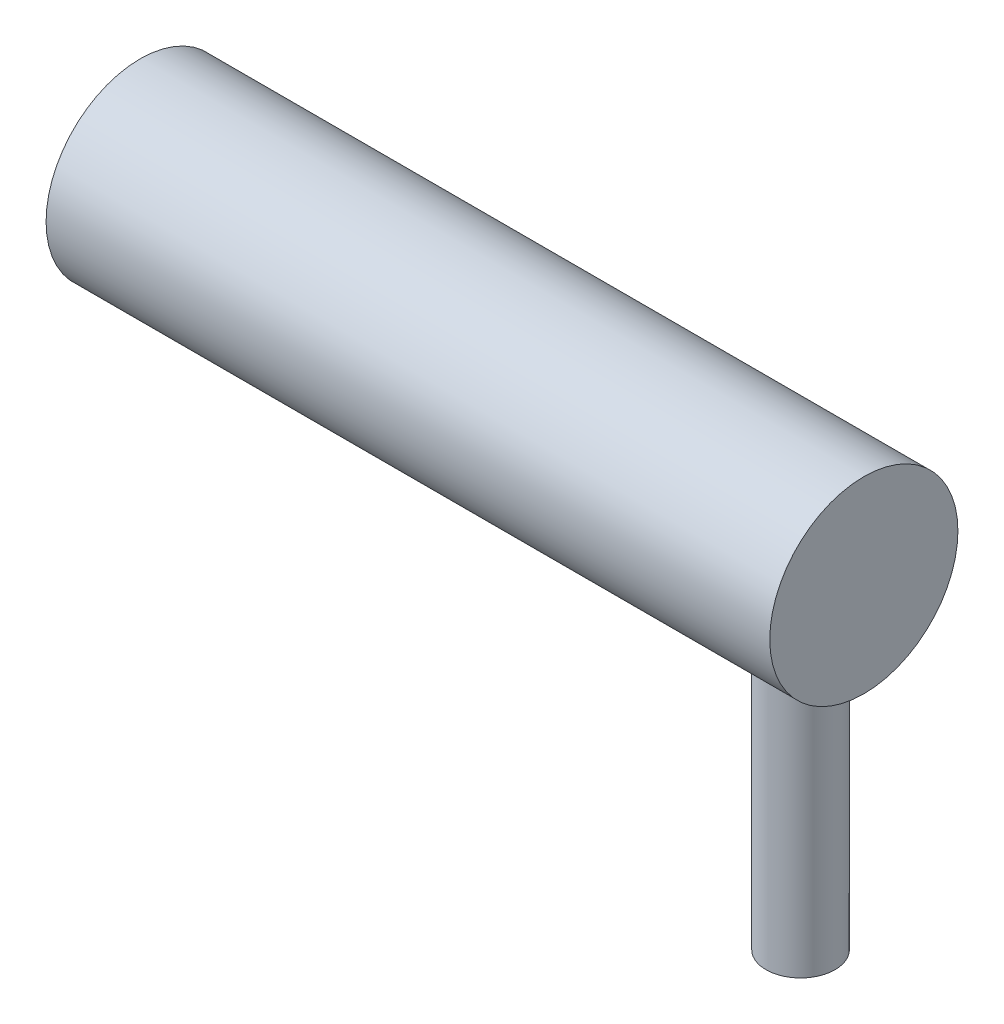
ISO-10303-21;
HEADER;
FILE_DESCRIPTION(('STEP AP214'),'2;1');
FILE_NAME('part.step','',(''),(''),'','','');
FILE_SCHEMA(('AUTOMOTIVE_DESIGN { 1 0 10303 214 1 1 1 1 }'));
ENDSEC;
DATA;
#1=APPLICATION_CONTEXT('core data for automotive mechanical design processes');
#2=APPLICATION_PROTOCOL_DEFINITION('international standard','automotive_design',2000,#1);
#3=PRODUCT_CONTEXT('',#1,'mechanical');
#4=PRODUCT('Part','Part','',(#3));
#5=PRODUCT_RELATED_PRODUCT_CATEGORY('part','',(#4));
#6=PRODUCT_DEFINITION_FORMATION('','',#4);
#7=PRODUCT_DEFINITION_CONTEXT('part definition',#1,'design');
#8=PRODUCT_DEFINITION('design','',#6,#7);
#9=PRODUCT_DEFINITION_SHAPE('','',#8);
#10=(LENGTH_UNIT() NAMED_UNIT(*) SI_UNIT(.MILLI.,.METRE.));
#11=(NAMED_UNIT(*) PLANE_ANGLE_UNIT() SI_UNIT($,.RADIAN.));
#12=(NAMED_UNIT(*) SI_UNIT($,.STERADIAN.) SOLID_ANGLE_UNIT());
#13=UNCERTAINTY_MEASURE_WITH_UNIT(LENGTH_MEASURE(1.E-05),#10,'distance_accuracy_value','');
#14=(GEOMETRIC_REPRESENTATION_CONTEXT(3) GLOBAL_UNCERTAINTY_ASSIGNED_CONTEXT((#13)) GLOBAL_UNIT_ASSIGNED_CONTEXT((#10,
#11,#12)) REPRESENTATION_CONTEXT('',''));
#15=CARTESIAN_POINT('',(0.,0.,0.));
#16=DIRECTION('',(0.,0.,1.));
#17=DIRECTION('',(1.,0.,0.));
#18=AXIS2_PLACEMENT_3D('',#15,#16,#17);
#19=CARTESIAN_POINT('',(82.502639328777,-96.,0.));
#20=DIRECTION('',(0.,1.,0.));
#21=DIRECTION('',(0.,0.,1.));
#22=AXIS2_PLACEMENT_3D('',#19,#20,#21);
#23=CYLINDRICAL_SURFACE('',#22,9.54582773587057);
#24=CARTESIAN_POINT('',(82.502639328777,-96.,0.));
#25=DIRECTION('',(0.,-1.,0.));
#26=DIRECTION('',(0.,0.,-1.));
#27=AXIS2_PLACEMENT_3D('',#24,#25,#26);
#28=CIRCLE('',#27,9.54582773587057);
#29=CARTESIAN_POINT('',(82.502639328777,-96.,-9.54582773587057));
#30=VERTEX_POINT('',#29);
#31=EDGE_CURVE('E11',#30,#30,#28,.T.);
#32=ORIENTED_EDGE('',*,*,#31,.F.);
#33=EDGE_LOOP('',(#32));
#34=FACE_BOUND('',#33,.T.);
#35=CARTESIAN_POINT('',(82.502639328777,-26.,0.));
#36=DIRECTION('',(0.,-1.,0.));
#37=DIRECTION('',(0.,0.,-1.));
#38=AXIS2_PLACEMENT_3D('',#35,#36,#37);
#39=CIRCLE('',#38,9.54582773587057);
#40=CARTESIAN_POINT('',(82.502639328777,-26.,-9.54582773587057));
#41=VERTEX_POINT('',#40);
#42=EDGE_CURVE('E48',#41,#41,#39,.T.);
#43=ORIENTED_EDGE('',*,*,#42,.T.);
#44=EDGE_LOOP('',(#43));
#45=FACE_BOUND('',#44,.T.);
#46=ADVANCED_FACE('F45',(#34,#45),#23,.T.);
#47=CARTESIAN_POINT('',(82.502639328777,-96.,0.));
#48=DIRECTION('',(0.,-1.,0.));
#49=DIRECTION('',(0.,0.,-1.));
#50=AXIS2_PLACEMENT_3D('',#47,#48,#49);
#51=PLANE('',#50);
#52=ORIENTED_EDGE('',*,*,#31,.T.);
#53=EDGE_LOOP('',(#52));
#54=FACE_BOUND('',#53,.T.);
#55=ADVANCED_FACE('F60',(#54),#51,.T.);
#56=CARTESIAN_POINT('',(82.502639328777,-26.,0.));
#57=DIRECTION('',(0.,-1.,0.));
#58=DIRECTION('',(0.,0.,-1.));
#59=AXIS2_PLACEMENT_3D('',#56,#57,#58);
#60=PLANE('',#59);
#61=ORIENTED_EDGE('',*,*,#42,.F.);
#62=EDGE_LOOP('',(#61));
#63=FACE_BOUND('',#62,.T.);
#64=ADVANCED_FACE('F58',(#63),#60,.F.);
#65=CLOSED_SHELL('',(#46,#55,#64));
#66=MANIFOLD_SOLID_BREP('B2',#65);
#67=CARTESIAN_POINT('',(100.,0.,0.));
#68=DIRECTION('',(-1.,0.,0.));
#69=DIRECTION('',(0.,0.,1.));
#70=AXIS2_PLACEMENT_3D('',#67,#68,#69);
#71=CYLINDRICAL_SURFACE('',#70,26.);
#72=CARTESIAN_POINT('',(100.,0.,0.));
#73=DIRECTION('',(1.,0.,0.));
#74=DIRECTION('',(0.,0.,-1.));
#75=AXIS2_PLACEMENT_3D('',#72,#73,#74);
#76=CIRCLE('',#75,26.);
#77=CARTESIAN_POINT('',(100.,0.,-26.));
#78=VERTEX_POINT('',#77);
#79=EDGE_CURVE('E44',#78,#78,#76,.T.);
#80=ORIENTED_EDGE('',*,*,#79,.F.);
#81=EDGE_LOOP('',(#80));
#82=FACE_BOUND('',#81,.T.);
#83=CARTESIAN_POINT('',(-100.,0.,0.));
#84=DIRECTION('',(1.,0.,0.));
#85=DIRECTION('',(0.,0.,-1.));
#86=AXIS2_PLACEMENT_3D('',#83,#84,#85);
#87=CIRCLE('',#86,26.);
#88=CARTESIAN_POINT('',(-100.,0.,-26.));
#89=VERTEX_POINT('',#88);
#90=EDGE_CURVE('E89',#89,#89,#87,.T.);
#91=ORIENTED_EDGE('',*,*,#90,.T.);
#92=EDGE_LOOP('',(#91));
#93=FACE_BOUND('',#92,.T.);
#94=ADVANCED_FACE('F86',(#82,#93),#71,.T.);
#95=CARTESIAN_POINT('',(100.,0.,0.));
#96=DIRECTION('',(1.,0.,0.));
#97=DIRECTION('',(0.,0.,-1.));
#98=AXIS2_PLACEMENT_3D('',#95,#96,#97);
#99=PLANE('',#98);
#100=ORIENTED_EDGE('',*,*,#79,.T.);
#101=EDGE_LOOP('',(#100));
#102=FACE_BOUND('',#101,.T.);
#103=ADVANCED_FACE('F103',(#102),#99,.T.);
#104=CARTESIAN_POINT('',(-100.,0.,0.));
#105=DIRECTION('',(1.,0.,0.));
#106=DIRECTION('',(0.,0.,-1.));
#107=AXIS2_PLACEMENT_3D('',#104,#105,#106);
#108=PLANE('',#107);
#109=ORIENTED_EDGE('',*,*,#90,.F.);
#110=EDGE_LOOP('',(#109));
#111=FACE_BOUND('',#110,.T.);
#112=ADVANCED_FACE('F101',(#111),#108,.F.);
#113=CLOSED_SHELL('',(#94,#103,#112));
#114=MANIFOLD_SOLID_BREP('B6',#113);
#115=ADVANCED_BREP_SHAPE_REPRESENTATION('',(#18,#66,#114),#14);
#116=SHAPE_DEFINITION_REPRESENTATION(#9,#115);
ENDSEC;
END-ISO-10303-21;
